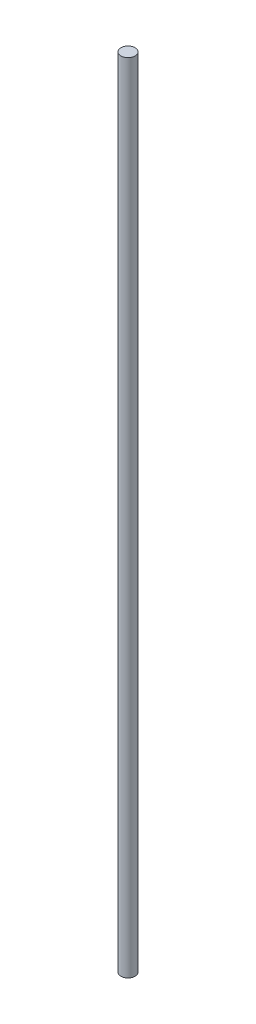
ISO-10303-21;
HEADER;
FILE_DESCRIPTION(('STEP AP214'),'2;1');
FILE_NAME('part.step','',(''),(''),'','','');
FILE_SCHEMA(('AUTOMOTIVE_DESIGN { 1 0 10303 214 1 1 1 1 }'));
ENDSEC;
DATA;
#1=APPLICATION_CONTEXT('core data for automotive mechanical design processes');
#2=APPLICATION_PROTOCOL_DEFINITION('international standard','automotive_design',2000,#1);
#3=PRODUCT_CONTEXT('',#1,'mechanical');
#4=PRODUCT('Part','Part','',(#3));
#5=PRODUCT_RELATED_PRODUCT_CATEGORY('part','',(#4));
#6=PRODUCT_DEFINITION_FORMATION('','',#4);
#7=PRODUCT_DEFINITION_CONTEXT('part definition',#1,'design');
#8=PRODUCT_DEFINITION('design','',#6,#7);
#9=PRODUCT_DEFINITION_SHAPE('','',#8);
#10=(LENGTH_UNIT() NAMED_UNIT(*) SI_UNIT(.MILLI.,.METRE.));
#11=(NAMED_UNIT(*) PLANE_ANGLE_UNIT() SI_UNIT($,.RADIAN.));
#12=(NAMED_UNIT(*) SI_UNIT($,.STERADIAN.) SOLID_ANGLE_UNIT());
#13=UNCERTAINTY_MEASURE_WITH_UNIT(LENGTH_MEASURE(1.E-05),#10,'distance_accuracy_value','');
#14=(GEOMETRIC_REPRESENTATION_CONTEXT(3) GLOBAL_UNCERTAINTY_ASSIGNED_CONTEXT((#13)) GLOBAL_UNIT_ASSIGNED_CONTEXT((#10,
#11,#12)) REPRESENTATION_CONTEXT('',''));
#15=CARTESIAN_POINT('',(0.,0.,0.));
#16=DIRECTION('',(0.,0.,1.));
#17=DIRECTION('',(1.,0.,0.));
#18=AXIS2_PLACEMENT_3D('',#15,#16,#17);
#19=CARTESIAN_POINT('',(0.,354.95000008,0.));
#20=DIRECTION('',(0.,-1.,0.));
#21=DIRECTION('',(0.,0.,-1.));
#22=AXIS2_PLACEMENT_3D('',#19,#20,#21);
#23=CYLINDRICAL_SURFACE('',#22,3.175);
#24=CARTESIAN_POINT('',(0.,354.95000008,0.));
#25=DIRECTION('',(0.,1.,0.));
#26=DIRECTION('',(0.,0.,1.));
#27=AXIS2_PLACEMENT_3D('',#24,#25,#26);
#28=CIRCLE('',#27,3.175);
#29=CARTESIAN_POINT('',(0.,354.95000008,-3.175));
#30=VERTEX_POINT('',#29);
#31=EDGE_CURVE('E10',#30,#30,#28,.T.);
#32=CARTESIAN_POINT('',(0.,0.,0.));
#33=DIRECTION('',(0.,1.,0.));
#34=DIRECTION('',(0.,0.,1.));
#35=AXIS2_PLACEMENT_3D('',#32,#33,#34);
#36=CIRCLE('',#35,3.175);
#37=CARTESIAN_POINT('',(0.,0.,-3.175));
#38=VERTEX_POINT('',#37);
#39=EDGE_CURVE('E34',#38,#38,#36,.T.);
#40=CARTESIAN_POINT('',(0.,354.95000008,-3.175));
#41=CARTESIAN_POINT('',(0.,351.252604245833,-3.175));
#42=CARTESIAN_POINT('',(0.,347.555208411667,-3.175));
#43=CARTESIAN_POINT('',(0.,340.160416743333,-3.175));
#44=CARTESIAN_POINT('',(0.,336.463020909167,-3.175));
#45=CARTESIAN_POINT('',(0.,329.068229240833,-3.175));
#46=CARTESIAN_POINT('',(0.,325.370833406667,-3.175));
#47=CARTESIAN_POINT('',(0.,317.976041738333,-3.175));
#48=CARTESIAN_POINT('',(0.,314.278645904167,-3.175));
#49=CARTESIAN_POINT('',(0.,306.883854235833,-3.175));
#50=CARTESIAN_POINT('',(0.,303.186458401667,-3.175));
#51=CARTESIAN_POINT('',(0.,295.791666733333,-3.175));
#52=CARTESIAN_POINT('',(0.,292.094270899167,-3.175));
#53=CARTESIAN_POINT('',(0.,284.699479230833,-3.175));
#54=CARTESIAN_POINT('',(0.,281.002083396667,-3.175));
#55=CARTESIAN_POINT('',(0.,273.607291728333,-3.175));
#56=CARTESIAN_POINT('',(0.,269.909895894167,-3.175));
#57=CARTESIAN_POINT('',(0.,262.515104225833,-3.175));
#58=CARTESIAN_POINT('',(0.,258.817708391667,-3.175));
#59=CARTESIAN_POINT('',(0.,251.422916723333,-3.175));
#60=CARTESIAN_POINT('',(0.,247.725520889167,-3.175));
#61=CARTESIAN_POINT('',(0.,240.330729220833,-3.175));
#62=CARTESIAN_POINT('',(0.,236.633333386667,-3.175));
#63=CARTESIAN_POINT('',(0.,229.238541718333,-3.175));
#64=CARTESIAN_POINT('',(0.,225.541145884167,-3.175));
#65=CARTESIAN_POINT('',(0.,218.146354215833,-3.175));
#66=CARTESIAN_POINT('',(0.,214.448958381667,-3.175));
#67=CARTESIAN_POINT('',(0.,207.054166713333,-3.175));
#68=CARTESIAN_POINT('',(0.,203.356770879167,-3.175));
#69=CARTESIAN_POINT('',(0.,195.961979210833,-3.175));
#70=CARTESIAN_POINT('',(0.,192.264583376667,-3.175));
#71=CARTESIAN_POINT('',(0.,184.869791708333,-3.175));
#72=CARTESIAN_POINT('',(0.,181.172395874167,-3.175));
#73=CARTESIAN_POINT('',(0.,173.777604205833,-3.175));
#74=CARTESIAN_POINT('',(0.,170.080208371667,-3.175));
#75=CARTESIAN_POINT('',(0.,162.685416703333,-3.175));
#76=CARTESIAN_POINT('',(0.,158.988020869167,-3.175));
#77=CARTESIAN_POINT('',(0.,151.593229200833,-3.175));
#78=CARTESIAN_POINT('',(0.,147.895833366667,-3.175));
#79=CARTESIAN_POINT('',(0.,140.501041698333,-3.175));
#80=CARTESIAN_POINT('',(0.,136.803645864167,-3.175));
#81=CARTESIAN_POINT('',(0.,129.408854195833,-3.175));
#82=CARTESIAN_POINT('',(0.,125.711458361667,-3.175));
#83=CARTESIAN_POINT('',(0.,118.316666693333,-3.175));
#84=CARTESIAN_POINT('',(0.,114.619270859167,-3.175));
#85=CARTESIAN_POINT('',(0.,107.224479190833,-3.175));
#86=CARTESIAN_POINT('',(0.,103.527083356667,-3.175));
#87=CARTESIAN_POINT('',(0.,96.1322916883333,-3.175));
#88=CARTESIAN_POINT('',(0.,92.4348958541666,-3.175));
#89=CARTESIAN_POINT('',(0.,85.0401041858333,-3.175));
#90=CARTESIAN_POINT('',(0.,81.3427083516666,-3.175));
#91=CARTESIAN_POINT('',(0.,73.9479166833333,-3.175));
#92=CARTESIAN_POINT('',(0.,70.2505208491666,-3.175));
#93=CARTESIAN_POINT('',(0.,62.8557291808333,-3.175));
#94=CARTESIAN_POINT('',(0.,59.1583333466666,-3.175));
#95=CARTESIAN_POINT('',(0.,51.7635416783333,-3.175));
#96=CARTESIAN_POINT('',(0.,48.0661458441666,-3.175));
#97=CARTESIAN_POINT('',(0.,40.6713541758333,-3.175));
#98=CARTESIAN_POINT('',(0.,36.9739583416666,-3.175));
#99=CARTESIAN_POINT('',(0.,29.5791666733333,-3.175));
#100=CARTESIAN_POINT('',(0.,25.8817708391666,-3.175));
#101=CARTESIAN_POINT('',(0.,18.4869791708333,-3.175));
#102=CARTESIAN_POINT('',(0.,14.7895833366666,-3.175));
#103=CARTESIAN_POINT('',(0.,7.39479166833329,-3.175));
#104=CARTESIAN_POINT('',(0.,3.69739583416662,-3.175));
#105=CARTESIAN_POINT('',(0.,0.,-3.175));
#106=B_SPLINE_CURVE_WITH_KNOTS('',3,(#40,#41,#42,#43,#44,#45,#46,#47,#48,#49,#50,#51,#52,#53,
#54,#55,#56,#57,#58,#59,#60,#61,#62,#63,#64,#65,#66,#67,#68,#69,#70,#71,#72,#73,#74,#75,#76,#77,
#78,#79,#80,#81,#82,#83,#84,#85,#86,#87,#88,#89,#90,#91,#92,#93,#94,#95,#96,#97,#98,#99,#100,
#101,#102,#103,#104,#105),.UNSPECIFIED.,.F.,.F.,(4,2,2,2,2,2,2,2,2,2,2,2,2,2,2,2,2,2,2,2,2,2,2,
2,2,2,2,2,2,2,2,2,4),(0.,11.0921875025,22.184375005,33.2765625074999,44.36875001,55.4609375125,
66.5531250149999,77.6453125175,88.73750002,99.8296875225,110.921875025,122.0140625275,
133.10625003,144.1984375325,155.290625035,166.3828125375,177.47500004,188.5671875425,
199.659375045,210.7515625475,221.84375005,232.9359375525,244.028125055,255.1203125575,
266.21250006,277.3046875625,288.396875065,299.4890625675,310.58125007,321.6734375725,
332.765625075,343.8578125775,354.95000008),.UNSPECIFIED.);
#107=EDGE_CURVE('BSEAM31',#30,#38,#106,.T.);
#108=ORIENTED_EDGE('',*,*,#31,.F.);
#109=ORIENTED_EDGE('',*,*,#39,.T.);
#110=ORIENTED_EDGE('',*,*,#107,.T.);
#111=ORIENTED_EDGE('',*,*,#107,.F.);
#112=EDGE_LOOP('',(#108,#110,#109,#111));
#113=FACE_BOUND('',#112,.T.);
#114=ADVANCED_FACE('F31',(#113),#23,.T.);
#115=CARTESIAN_POINT('',(0.,354.95000008,0.));
#116=DIRECTION('',(0.,1.,0.));
#117=DIRECTION('',(0.,0.,1.));
#118=AXIS2_PLACEMENT_3D('',#115,#116,#117);
#119=PLANE('',#118);
#120=ORIENTED_EDGE('',*,*,#31,.T.);
#121=EDGE_LOOP('',(#120));
#122=FACE_BOUND('',#121,.T.);
#123=ADVANCED_FACE('F46',(#122),#119,.T.);
#124=CARTESIAN_POINT('',(0.,0.,0.));
#125=DIRECTION('',(0.,1.,0.));
#126=DIRECTION('',(0.,0.,1.));
#127=AXIS2_PLACEMENT_3D('',#124,#125,#126);
#128=PLANE('',#127);
#129=ORIENTED_EDGE('',*,*,#39,.F.);
#130=EDGE_LOOP('',(#129));
#131=FACE_BOUND('',#130,.T.);
#132=ADVANCED_FACE('F44',(#131),#128,.F.);
#133=CLOSED_SHELL('',(#114,#123,#132));
#134=MANIFOLD_SOLID_BREP('B2',#133);
#135=ADVANCED_BREP_SHAPE_REPRESENTATION('',(#18,#134),#14);
#136=SHAPE_DEFINITION_REPRESENTATION(#9,#135);
ENDSEC;
END-ISO-10303-21;
